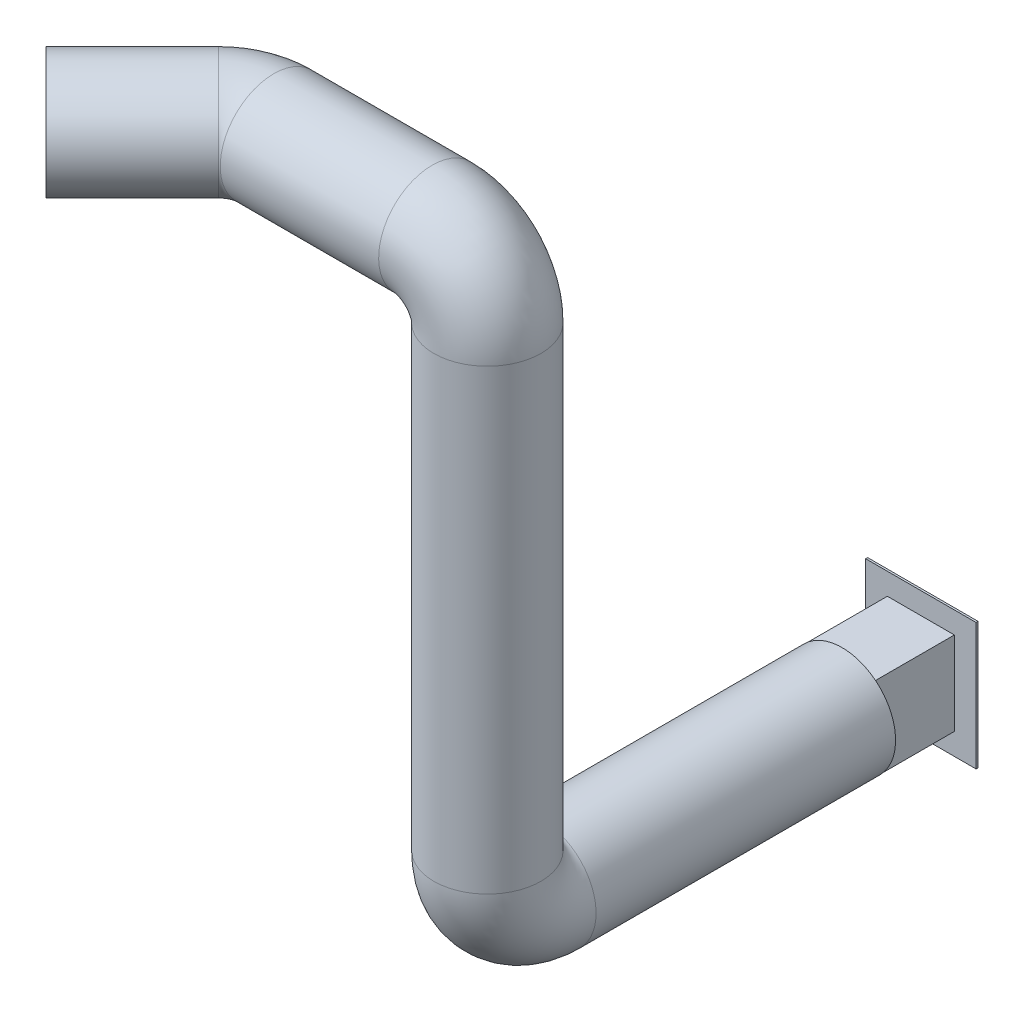
ISO-10303-21;
HEADER;
FILE_DESCRIPTION(('STEP AP214'),'2;1');
FILE_NAME('part.step','',(''),(''),'','','');
FILE_SCHEMA(('AUTOMOTIVE_DESIGN { 1 0 10303 214 1 1 1 1 }'));
ENDSEC;
DATA;
#1=APPLICATION_CONTEXT('core data for automotive mechanical design processes');
#2=APPLICATION_PROTOCOL_DEFINITION('international standard','automotive_design',2000,#1);
#3=PRODUCT_CONTEXT('',#1,'mechanical');
#4=PRODUCT('Part','Part','',(#3));
#5=PRODUCT_RELATED_PRODUCT_CATEGORY('part','',(#4));
#6=PRODUCT_DEFINITION_FORMATION('','',#4);
#7=PRODUCT_DEFINITION_CONTEXT('part definition',#1,'design');
#8=PRODUCT_DEFINITION('design','',#6,#7);
#9=PRODUCT_DEFINITION_SHAPE('','',#8);
#10=(LENGTH_UNIT() NAMED_UNIT(*) SI_UNIT(.MILLI.,.METRE.));
#11=(NAMED_UNIT(*) PLANE_ANGLE_UNIT() SI_UNIT($,.RADIAN.));
#12=(NAMED_UNIT(*) SI_UNIT($,.STERADIAN.) SOLID_ANGLE_UNIT());
#13=UNCERTAINTY_MEASURE_WITH_UNIT(LENGTH_MEASURE(1.E-05),#10,'distance_accuracy_value','');
#14=(GEOMETRIC_REPRESENTATION_CONTEXT(3) GLOBAL_UNCERTAINTY_ASSIGNED_CONTEXT((#13)) GLOBAL_UNIT_ASSIGNED_CONTEXT((#10,
#11,#12)) REPRESENTATION_CONTEXT('',''));
#15=CARTESIAN_POINT('',(0.,0.,0.));
#16=DIRECTION('',(0.,0.,1.));
#17=DIRECTION('',(1.,0.,0.));
#18=AXIS2_PLACEMENT_3D('',#15,#16,#17);
#19=CARTESIAN_POINT('',(0.,0.,2.5));
#20=DIRECTION('',(0.,0.,1.));
#21=DIRECTION('',(1.,0.,0.));
#22=AXIS2_PLACEMENT_3D('',#19,#20,#21);
#23=PLANE('',#22);
#24=DIRECTION('',(0.,-1.,0.));
#25=VECTOR('',#24,1.);
#26=CARTESIAN_POINT('',(0.,0.,2.5));
#27=LINE('',#26,#25);
#28=CARTESIAN_POINT('',(0.,0.,2.5));
#29=VERTEX_POINT('',#28);
#30=CARTESIAN_POINT('',(0.,-161.,2.5));
#31=VERTEX_POINT('',#30);
#32=EDGE_CURVE('E204',#29,#31,#27,.T.);
#33=ORIENTED_EDGE('',*,*,#32,.T.);
#34=DIRECTION('',(1.,0.,0.));
#35=VECTOR('',#34,1.);
#36=CARTESIAN_POINT('',(0.,-161.,2.5));
#37=LINE('',#36,#35);
#38=CARTESIAN_POINT('',(140.,-161.,2.5));
#39=VERTEX_POINT('',#38);
#40=EDGE_CURVE('E207',#31,#39,#37,.T.);
#41=ORIENTED_EDGE('',*,*,#40,.T.);
#42=DIRECTION('',(0.,1.,0.));
#43=VECTOR('',#42,1.);
#44=CARTESIAN_POINT('',(140.,0.,2.5));
#45=LINE('',#44,#43);
#46=CARTESIAN_POINT('',(140.,0.,2.5));
#47=VERTEX_POINT('',#46);
#48=EDGE_CURVE('E210',#39,#47,#45,.T.);
#49=ORIENTED_EDGE('',*,*,#48,.T.);
#50=DIRECTION('',(-1.,0.,0.));
#51=VECTOR('',#50,1.);
#52=CARTESIAN_POINT('',(0.,0.,2.5));
#53=LINE('',#52,#51);
#54=EDGE_CURVE('E212',#47,#29,#53,.T.);
#55=ORIENTED_EDGE('',*,*,#54,.T.);
#56=EDGE_LOOP('',(#33,#41,#49,#55));
#57=FACE_BOUND('',#56,.T.);
#58=DIRECTION('',(0.,-1.,0.));
#59=VECTOR('',#58,1.);
#60=CARTESIAN_POINT('',(27.5,-27.5,2.5));
#61=LINE('',#60,#59);
#62=CARTESIAN_POINT('',(27.5,-27.5,2.5));
#63=VERTEX_POINT('',#62);
#64=CARTESIAN_POINT('',(27.5,-133.5,2.5));
#65=VERTEX_POINT('',#64);
#66=EDGE_CURVE('E172',#63,#65,#61,.T.);
#67=ORIENTED_EDGE('',*,*,#66,.F.);
#68=DIRECTION('',(-1.,0.,0.));
#69=VECTOR('',#68,1.);
#70=CARTESIAN_POINT('',(27.5,-27.5,2.5));
#71=LINE('',#70,#69);
#72=CARTESIAN_POINT('',(112.5,-27.5,2.5));
#73=VERTEX_POINT('',#72);
#74=EDGE_CURVE('E155',#73,#63,#71,.T.);
#75=ORIENTED_EDGE('',*,*,#74,.F.);
#76=DIRECTION('',(0.,1.,0.));
#77=VECTOR('',#76,1.);
#78=CARTESIAN_POINT('',(112.5,-27.5,2.5));
#79=LINE('',#78,#77);
#80=CARTESIAN_POINT('',(112.5,-133.5,2.5));
#81=VERTEX_POINT('',#80);
#82=EDGE_CURVE('E160',#81,#73,#79,.T.);
#83=ORIENTED_EDGE('',*,*,#82,.F.);
#84=DIRECTION('',(1.,0.,0.));
#85=VECTOR('',#84,1.);
#86=CARTESIAN_POINT('',(27.5,-133.5,2.5));
#87=LINE('',#86,#85);
#88=EDGE_CURVE('E174',#65,#81,#87,.T.);
#89=ORIENTED_EDGE('',*,*,#88,.F.);
#90=EDGE_LOOP('',(#67,#75,#83,#89));
#91=FACE_BOUND('',#90,.T.);
#92=ADVANCED_FACE('F33',(#57,#91),#23,.T.);
#93=CARTESIAN_POINT('',(0.,0.,0.));
#94=DIRECTION('',(0.,0.,1.));
#95=DIRECTION('',(1.,0.,0.));
#96=AXIS2_PLACEMENT_3D('',#93,#94,#95);
#97=PLANE('',#96);
#98=DIRECTION('',(0.,-1.,0.));
#99=VECTOR('',#98,1.);
#100=CARTESIAN_POINT('',(0.,0.,0.));
#101=LINE('',#100,#99);
#102=CARTESIAN_POINT('',(0.,0.,0.));
#103=VERTEX_POINT('',#102);
#104=CARTESIAN_POINT('',(0.,-161.,0.));
#105=VERTEX_POINT('',#104);
#106=EDGE_CURVE('E203',#103,#105,#101,.T.);
#107=ORIENTED_EDGE('',*,*,#106,.F.);
#108=DIRECTION('',(-1.,0.,0.));
#109=VECTOR('',#108,1.);
#110=CARTESIAN_POINT('',(0.,0.,0.));
#111=LINE('',#110,#109);
#112=CARTESIAN_POINT('',(140.,0.,0.));
#113=VERTEX_POINT('',#112);
#114=EDGE_CURVE('E208',#113,#103,#111,.T.);
#115=ORIENTED_EDGE('',*,*,#114,.F.);
#116=DIRECTION('',(0.,1.,0.));
#117=VECTOR('',#116,1.);
#118=CARTESIAN_POINT('',(140.,0.,0.));
#119=LINE('',#118,#117);
#120=CARTESIAN_POINT('',(140.,-161.,0.));
#121=VERTEX_POINT('',#120);
#122=EDGE_CURVE('E219',#121,#113,#119,.T.);
#123=ORIENTED_EDGE('',*,*,#122,.F.);
#124=DIRECTION('',(1.,0.,0.));
#125=VECTOR('',#124,1.);
#126=CARTESIAN_POINT('',(0.,-161.,0.));
#127=LINE('',#126,#125);
#128=EDGE_CURVE('E217',#105,#121,#127,.T.);
#129=ORIENTED_EDGE('',*,*,#128,.F.);
#130=EDGE_LOOP('',(#107,#115,#123,#129));
#131=FACE_BOUND('',#130,.T.);
#132=DIRECTION('',(0.,1.,0.));
#133=VECTOR('',#132,1.);
#134=CARTESIAN_POINT('',(110.,-131.,0.));
#135=LINE('',#134,#133);
#136=CARTESIAN_POINT('',(110.,-131.,0.));
#137=VERTEX_POINT('',#136);
#138=CARTESIAN_POINT('',(110.,-30.,0.));
#139=VERTEX_POINT('',#138);
#140=EDGE_CURVE('E56',#137,#139,#135,.T.);
#141=ORIENTED_EDGE('',*,*,#140,.T.);
#142=DIRECTION('',(-1.,0.,0.));
#143=VECTOR('',#142,1.);
#144=CARTESIAN_POINT('',(30.,-30.,0.));
#145=LINE('',#144,#143);
#146=CARTESIAN_POINT('',(30.,-30.,0.));
#147=VERTEX_POINT('',#146);
#148=EDGE_CURVE('E186',#139,#147,#145,.T.);
#149=ORIENTED_EDGE('',*,*,#148,.T.);
#150=DIRECTION('',(0.,-1.,0.));
#151=VECTOR('',#150,1.);
#152=CARTESIAN_POINT('',(30.,-131.,0.));
#153=LINE('',#152,#151);
#154=CARTESIAN_POINT('',(30.,-131.,0.));
#155=VERTEX_POINT('',#154);
#156=EDGE_CURVE('E189',#147,#155,#153,.T.);
#157=ORIENTED_EDGE('',*,*,#156,.T.);
#158=DIRECTION('',(1.,0.,0.));
#159=VECTOR('',#158,1.);
#160=CARTESIAN_POINT('',(30.,-131.,0.));
#161=LINE('',#160,#159);
#162=EDGE_CURVE('E192',#155,#137,#161,.T.);
#163=ORIENTED_EDGE('',*,*,#162,.T.);
#164=EDGE_LOOP('',(#141,#149,#157,#163));
#165=FACE_BOUND('',#164,.T.);
#166=ADVANCED_FACE('F237',(#131,#165),#97,.F.);
#167=CARTESIAN_POINT('',(0.,0.,2.5));
#168=DIRECTION('',(1.,0.,0.));
#169=DIRECTION('',(0.,0.,-1.));
#170=AXIS2_PLACEMENT_3D('',#167,#168,#169);
#171=PLANE('',#170);
#172=ORIENTED_EDGE('',*,*,#106,.T.);
#173=DIRECTION('',(0.,0.,-1.));
#174=VECTOR('',#173,1.);
#175=CARTESIAN_POINT('',(0.,-161.,2.5));
#176=LINE('',#175,#174);
#177=EDGE_CURVE('E11',#31,#105,#176,.T.);
#178=ORIENTED_EDGE('',*,*,#177,.F.);
#179=ORIENTED_EDGE('',*,*,#32,.F.);
#180=DIRECTION('',(0.,0.,-1.));
#181=VECTOR('',#180,1.);
#182=CARTESIAN_POINT('',(0.,0.,2.5));
#183=LINE('',#182,#181);
#184=EDGE_CURVE('E214',#29,#103,#183,.T.);
#185=ORIENTED_EDGE('',*,*,#184,.T.);
#186=EDGE_LOOP('',(#172,#178,#179,#185));
#187=FACE_BOUND('',#186,.T.);
#188=ADVANCED_FACE('F35',(#187),#171,.F.);
#189=CARTESIAN_POINT('',(0.,-161.,2.5));
#190=DIRECTION('',(0.,1.,0.));
#191=DIRECTION('',(0.,0.,1.));
#192=AXIS2_PLACEMENT_3D('',#189,#190,#191);
#193=PLANE('',#192);
#194=ORIENTED_EDGE('',*,*,#128,.T.);
#195=DIRECTION('',(0.,0.,-1.));
#196=VECTOR('',#195,1.);
#197=CARTESIAN_POINT('',(140.,-161.,2.5));
#198=LINE('',#197,#196);
#199=EDGE_CURVE('E41',#39,#121,#198,.T.);
#200=ORIENTED_EDGE('',*,*,#199,.F.);
#201=ORIENTED_EDGE('',*,*,#40,.F.);
#202=ORIENTED_EDGE('',*,*,#177,.T.);
#203=EDGE_LOOP('',(#194,#200,#201,#202));
#204=FACE_BOUND('',#203,.T.);
#205=ADVANCED_FACE('F248',(#204),#193,.F.);
#206=CARTESIAN_POINT('',(140.,0.,2.5));
#207=DIRECTION('',(-1.,0.,0.));
#208=DIRECTION('',(0.,0.,1.));
#209=AXIS2_PLACEMENT_3D('',#206,#207,#208);
#210=PLANE('',#209);
#211=ORIENTED_EDGE('',*,*,#122,.T.);
#212=DIRECTION('',(0.,0.,-1.));
#213=VECTOR('',#212,1.);
#214=CARTESIAN_POINT('',(140.,0.,2.5));
#215=LINE('',#214,#213);
#216=EDGE_CURVE('E224',#47,#113,#215,.T.);
#217=ORIENTED_EDGE('',*,*,#216,.F.);
#218=ORIENTED_EDGE('',*,*,#48,.F.);
#219=ORIENTED_EDGE('',*,*,#199,.T.);
#220=EDGE_LOOP('',(#211,#217,#218,#219));
#221=FACE_BOUND('',#220,.T.);
#222=ADVANCED_FACE('F231',(#221),#210,.F.);
#223=CARTESIAN_POINT('',(0.,0.,2.5));
#224=DIRECTION('',(0.,-1.,0.));
#225=DIRECTION('',(1.,0.,0.));
#226=AXIS2_PLACEMENT_3D('',#223,#224,#225);
#227=PLANE('',#226);
#228=ORIENTED_EDGE('',*,*,#114,.T.);
#229=ORIENTED_EDGE('',*,*,#184,.F.);
#230=ORIENTED_EDGE('',*,*,#54,.F.);
#231=ORIENTED_EDGE('',*,*,#216,.T.);
#232=EDGE_LOOP('',(#228,#229,#230,#231));
#233=FACE_BOUND('',#232,.T.);
#234=ADVANCED_FACE('F241',(#233),#227,.F.);
#235=CARTESIAN_POINT('',(110.,-131.,2.5));
#236=DIRECTION('',(-1.,0.,0.));
#237=DIRECTION('',(0.,0.,1.));
#238=AXIS2_PLACEMENT_3D('',#235,#236,#237);
#239=PLANE('',#238);
#240=ORIENTED_EDGE('',*,*,#140,.F.);
#241=DIRECTION('',(0.,0.,-1.));
#242=VECTOR('',#241,1.);
#243=CARTESIAN_POINT('',(110.,-131.,2.5));
#244=LINE('',#243,#242);
#245=CARTESIAN_POINT('',(110.,-131.,102.5));
#246=VERTEX_POINT('',#245);
#247=EDGE_CURVE('E195',#246,#137,#244,.T.);
#248=ORIENTED_EDGE('',*,*,#247,.F.);
#249=DIRECTION('',(0.,1.,0.));
#250=VECTOR('',#249,1.);
#251=CARTESIAN_POINT('',(110.,-30.,102.5));
#252=LINE('',#251,#250);
#253=CARTESIAN_POINT('',(110.,-30.,102.5));
#254=VERTEX_POINT('',#253);
#255=EDGE_CURVE('E149',#246,#254,#252,.T.);
#256=ORIENTED_EDGE('',*,*,#255,.T.);
#257=DIRECTION('',(0.,0.,-1.));
#258=VECTOR('',#257,1.);
#259=CARTESIAN_POINT('',(110.,-30.,2.5));
#260=LINE('',#259,#258);
#261=EDGE_CURVE('E201',#254,#139,#260,.T.);
#262=ORIENTED_EDGE('',*,*,#261,.T.);
#263=EDGE_LOOP('',(#240,#248,#256,#262));
#264=FACE_BOUND('',#263,.T.);
#265=ADVANCED_FACE('F262',(#264),#239,.T.);
#266=CARTESIAN_POINT('',(30.,-30.,2.5));
#267=DIRECTION('',(0.,-1.,0.));
#268=DIRECTION('',(0.,0.,-1.));
#269=AXIS2_PLACEMENT_3D('',#266,#267,#268);
#270=PLANE('',#269);
#271=ORIENTED_EDGE('',*,*,#148,.F.);
#272=ORIENTED_EDGE('',*,*,#261,.F.);
#273=DIRECTION('',(-1.,0.,0.));
#274=VECTOR('',#273,1.);
#275=CARTESIAN_POINT('',(30.,-30.,102.5));
#276=LINE('',#275,#274);
#277=CARTESIAN_POINT('',(30.,-30.,102.5));
#278=VERTEX_POINT('',#277);
#279=EDGE_CURVE('E152',#254,#278,#276,.T.);
#280=ORIENTED_EDGE('',*,*,#279,.T.);
#281=DIRECTION('',(0.,0.,-1.));
#282=VECTOR('',#281,1.);
#283=CARTESIAN_POINT('',(30.,-30.,2.5));
#284=LINE('',#283,#282);
#285=EDGE_CURVE('E199',#278,#147,#284,.T.);
#286=ORIENTED_EDGE('',*,*,#285,.T.);
#287=EDGE_LOOP('',(#271,#272,#280,#286));
#288=FACE_BOUND('',#287,.T.);
#289=ADVANCED_FACE('F269',(#288),#270,.T.);
#290=CARTESIAN_POINT('',(30.,-131.,2.5));
#291=DIRECTION('',(1.,0.,0.));
#292=DIRECTION('',(0.,0.,-1.));
#293=AXIS2_PLACEMENT_3D('',#290,#291,#292);
#294=PLANE('',#293);
#295=ORIENTED_EDGE('',*,*,#156,.F.);
#296=ORIENTED_EDGE('',*,*,#285,.F.);
#297=DIRECTION('',(0.,-1.,0.));
#298=VECTOR('',#297,1.);
#299=CARTESIAN_POINT('',(30.,-30.,102.5));
#300=LINE('',#299,#298);
#301=CARTESIAN_POINT('',(30.,-131.,102.5));
#302=VERTEX_POINT('',#301);
#303=EDGE_CURVE('E142',#278,#302,#300,.T.);
#304=ORIENTED_EDGE('',*,*,#303,.T.);
#305=DIRECTION('',(0.,0.,-1.));
#306=VECTOR('',#305,1.);
#307=CARTESIAN_POINT('',(30.,-131.,2.5));
#308=LINE('',#307,#306);
#309=EDGE_CURVE('E197',#302,#155,#308,.T.);
#310=ORIENTED_EDGE('',*,*,#309,.T.);
#311=EDGE_LOOP('',(#295,#296,#304,#310));
#312=FACE_BOUND('',#311,.T.);
#313=ADVANCED_FACE('F273',(#312),#294,.T.);
#314=CARTESIAN_POINT('',(30.,-131.,2.5));
#315=DIRECTION('',(0.,1.,0.));
#316=DIRECTION('',(0.,0.,1.));
#317=AXIS2_PLACEMENT_3D('',#314,#315,#316);
#318=PLANE('',#317);
#319=ORIENTED_EDGE('',*,*,#162,.F.);
#320=ORIENTED_EDGE('',*,*,#309,.F.);
#321=DIRECTION('',(1.,0.,0.));
#322=VECTOR('',#321,1.);
#323=CARTESIAN_POINT('',(30.,-131.,102.5));
#324=LINE('',#323,#322);
#325=EDGE_CURVE('E146',#302,#246,#324,.T.);
#326=ORIENTED_EDGE('',*,*,#325,.T.);
#327=ORIENTED_EDGE('',*,*,#247,.T.);
#328=EDGE_LOOP('',(#319,#320,#326,#327));
#329=FACE_BOUND('',#328,.T.);
#330=ADVANCED_FACE('F278',(#329),#318,.T.);
#331=CARTESIAN_POINT('',(27.5,-27.5,102.5));
#332=DIRECTION('',(0.,-1.,0.));
#333=DIRECTION('',(0.,0.,-1.));
#334=AXIS2_PLACEMENT_3D('',#331,#332,#333);
#335=PLANE('',#334);
#336=ORIENTED_EDGE('',*,*,#74,.T.);
#337=DIRECTION('',(0.,0.,-1.));
#338=VECTOR('',#337,1.);
#339=CARTESIAN_POINT('',(27.5,-27.5,102.5));
#340=LINE('',#339,#338);
#341=CARTESIAN_POINT('',(27.5,-27.5,102.5));
#342=VERTEX_POINT('',#341);
#343=EDGE_CURVE('E183',#342,#63,#340,.T.);
#344=ORIENTED_EDGE('',*,*,#343,.F.);
#345=DIRECTION('',(-1.,0.,0.));
#346=VECTOR('',#345,1.);
#347=CARTESIAN_POINT('',(27.5,-27.5,102.5));
#348=LINE('',#347,#346);
#349=CARTESIAN_POINT('',(112.5,-27.5,102.5));
#350=VERTEX_POINT('',#349);
#351=EDGE_CURVE('E156',#350,#342,#348,.T.);
#352=ORIENTED_EDGE('',*,*,#351,.F.);
#353=DIRECTION('',(0.,0.,-1.));
#354=VECTOR('',#353,1.);
#355=CARTESIAN_POINT('',(112.5,-27.5,102.5));
#356=LINE('',#355,#354);
#357=EDGE_CURVE('E169',#350,#73,#356,.T.);
#358=ORIENTED_EDGE('',*,*,#357,.T.);
#359=EDGE_LOOP('',(#336,#344,#352,#358));
#360=FACE_BOUND('',#359,.T.);
#361=ADVANCED_FACE('F284',(#360),#335,.F.);
#362=CARTESIAN_POINT('',(27.5,-27.5,102.5));
#363=DIRECTION('',(1.,0.,0.));
#364=DIRECTION('',(0.,0.,-1.));
#365=AXIS2_PLACEMENT_3D('',#362,#363,#364);
#366=PLANE('',#365);
#367=ORIENTED_EDGE('',*,*,#66,.T.);
#368=DIRECTION('',(0.,0.,-1.));
#369=VECTOR('',#368,1.);
#370=CARTESIAN_POINT('',(27.5,-133.5,102.5));
#371=LINE('',#370,#369);
#372=CARTESIAN_POINT('',(27.5,-133.5,102.5));
#373=VERTEX_POINT('',#372);
#374=EDGE_CURVE('E180',#373,#65,#371,.T.);
#375=ORIENTED_EDGE('',*,*,#374,.F.);
#376=DIRECTION('',(0.,-1.,0.));
#377=VECTOR('',#376,1.);
#378=CARTESIAN_POINT('',(27.5,-27.5,102.5));
#379=LINE('',#378,#377);
#380=EDGE_CURVE('E159',#342,#373,#379,.T.);
#381=ORIENTED_EDGE('',*,*,#380,.F.);
#382=ORIENTED_EDGE('',*,*,#343,.T.);
#383=EDGE_LOOP('',(#367,#375,#381,#382));
#384=FACE_BOUND('',#383,.T.);
#385=ADVANCED_FACE('F288',(#384),#366,.F.);
#386=CARTESIAN_POINT('',(27.5,-133.5,102.5));
#387=DIRECTION('',(0.,1.,0.));
#388=DIRECTION('',(0.,0.,1.));
#389=AXIS2_PLACEMENT_3D('',#386,#387,#388);
#390=PLANE('',#389);
#391=ORIENTED_EDGE('',*,*,#88,.T.);
#392=DIRECTION('',(0.,0.,-1.));
#393=VECTOR('',#392,1.);
#394=CARTESIAN_POINT('',(112.5,-133.5,102.5));
#395=LINE('',#394,#393);
#396=CARTESIAN_POINT('',(112.5,-133.5,102.5));
#397=VERTEX_POINT('',#396);
#398=EDGE_CURVE('E48',#397,#81,#395,.T.);
#399=ORIENTED_EDGE('',*,*,#398,.F.);
#400=DIRECTION('',(1.,0.,0.));
#401=VECTOR('',#400,1.);
#402=CARTESIAN_POINT('',(27.5,-133.5,102.5));
#403=LINE('',#402,#401);
#404=EDGE_CURVE('E163',#373,#397,#403,.T.);
#405=ORIENTED_EDGE('',*,*,#404,.F.);
#406=ORIENTED_EDGE('',*,*,#374,.T.);
#407=EDGE_LOOP('',(#391,#399,#405,#406));
#408=FACE_BOUND('',#407,.T.);
#409=ADVANCED_FACE('F292',(#408),#390,.F.);
#410=CARTESIAN_POINT('',(112.5,-27.5,102.5));
#411=DIRECTION('',(-1.,0.,0.));
#412=DIRECTION('',(0.,0.,1.));
#413=AXIS2_PLACEMENT_3D('',#410,#411,#412);
#414=PLANE('',#413);
#415=ORIENTED_EDGE('',*,*,#82,.T.);
#416=ORIENTED_EDGE('',*,*,#357,.F.);
#417=DIRECTION('',(0.,1.,0.));
#418=VECTOR('',#417,1.);
#419=CARTESIAN_POINT('',(112.5,-27.5,102.5));
#420=LINE('',#419,#418);
#421=EDGE_CURVE('E166',#397,#350,#420,.T.);
#422=ORIENTED_EDGE('',*,*,#421,.F.);
#423=ORIENTED_EDGE('',*,*,#398,.T.);
#424=EDGE_LOOP('',(#415,#416,#422,#423));
#425=FACE_BOUND('',#424,.T.);
#426=ADVANCED_FACE('F296',(#425),#414,.F.);
#427=CARTESIAN_POINT('',(70.,-80.5,102.5));
#428=DIRECTION('',(0.,0.,1.));
#429=DIRECTION('',(1.,0.,0.));
#430=AXIS2_PLACEMENT_3D('',#427,#428,#429);
#431=PLANE('',#430);
#432=ORIENTED_EDGE('',*,*,#303,.F.);
#433=ORIENTED_EDGE('',*,*,#279,.F.);
#434=ORIENTED_EDGE('',*,*,#255,.F.);
#435=ORIENTED_EDGE('',*,*,#325,.F.);
#436=EDGE_LOOP('',(#432,#433,#434,#435));
#437=FACE_BOUND('',#436,.T.);
#438=ADVANCED_FACE('F300',(#437),#431,.F.);
#439=CARTESIAN_POINT('',(70.,-80.5,102.5));
#440=DIRECTION('',(0.,0.,1.));
#441=DIRECTION('',(1.,0.,0.));
#442=AXIS2_PLACEMENT_3D('',#439,#440,#441);
#443=CIRCLE('',#442,67.9356312990466);
#444=EDGE_CURVE('E135',#350,#342,#443,.T.);
#445=ORIENTED_EDGE('',*,*,#444,.F.);
#446=ORIENTED_EDGE('',*,*,#351,.T.);
#447=EDGE_LOOP('',(#445,#446));
#448=FACE_BOUND('',#447,.T.);
#449=ADVANCED_FACE('F310',(#448),#431,.F.);
#450=EDGE_CURVE('E143',#342,#373,#443,.T.);
#451=ORIENTED_EDGE('',*,*,#450,.F.);
#452=ORIENTED_EDGE('',*,*,#380,.T.);
#453=EDGE_LOOP('',(#451,#452));
#454=FACE_BOUND('',#453,.T.);
#455=ADVANCED_FACE('F420',(#454),#431,.F.);
#456=EDGE_CURVE('E133',#373,#397,#443,.T.);
#457=ORIENTED_EDGE('',*,*,#456,.F.);
#458=ORIENTED_EDGE('',*,*,#404,.T.);
#459=EDGE_LOOP('',(#457,#458));
#460=FACE_BOUND('',#459,.T.);
#461=ADVANCED_FACE('F305',(#460),#431,.F.);
#462=CARTESIAN_POINT('',(70.,-80.5,202.5));
#463=DIRECTION('',(0.,0.,-1.));
#464=DIRECTION('',(-1.,0.,0.));
#465=AXIS2_PLACEMENT_3D('',#462,#463,#464);
#466=CYLINDRICAL_SURFACE('',#465,67.9356312990466);
#467=ORIENTED_EDGE('',*,*,#444,.T.);
#468=ORIENTED_EDGE('',*,*,#450,.T.);
#469=ORIENTED_EDGE('',*,*,#456,.T.);
#470=EDGE_CURVE('E129',#397,#350,#443,.T.);
#471=ORIENTED_EDGE('',*,*,#470,.T.);
#472=EDGE_LOOP('',(#467,#468,#469,#471));
#473=FACE_BOUND('',#472,.T.);
#474=CARTESIAN_POINT('',(70.,-80.5,482.5));
#475=DIRECTION('',(0.,0.,1.));
#476=DIRECTION('',(1.,0.,0.));
#477=AXIS2_PLACEMENT_3D('',#474,#475,#476);
#478=CIRCLE('',#477,67.9356312990466);
#479=CARTESIAN_POINT('',(70.,-148.435631299047,482.5));
#480=VERTEX_POINT('',#479);
#481=EDGE_CURVE('E343',#480,#480,#478,.T.);
#482=ORIENTED_EDGE('',*,*,#481,.F.);
#483=EDGE_LOOP('',(#482));
#484=FACE_BOUND('',#483,.T.);
#485=ADVANCED_FACE('F301',(#473,#484),#466,.T.);
#486=ORIENTED_EDGE('',*,*,#470,.F.);
#487=ORIENTED_EDGE('',*,*,#421,.T.);
#488=EDGE_LOOP('',(#486,#487));
#489=FACE_BOUND('',#488,.T.);
#490=ADVANCED_FACE('F304',(#489),#431,.F.);
#491=CARTESIAN_POINT('',(-360.,639.5,682.5));
#492=DIRECTION('',(-0.707106781186547,0.,0.707106781186547));
#493=DIRECTION('',(0.,1.,0.));
#494=AXIS2_PLACEMENT_3D('',#491,#492,#493);
#495=PLANE('',#494);
#496=CARTESIAN_POINT('',(-360.,639.5,682.5));
#497=DIRECTION('',(-0.707106781186547,0.,0.707106781186547));
#498=DIRECTION('',(0.,1.,0.));
#499=AXIS2_PLACEMENT_3D('',#496,#497,#498);
#500=CIRCLE('',#499,67.9356312990466);
#501=CARTESIAN_POINT('',(-360.,707.435631299047,682.5));
#502=VERTEX_POINT('',#501);
#503=EDGE_CURVE('E126',#502,#502,#500,.T.);
#504=ORIENTED_EDGE('',*,*,#503,.T.);
#505=EDGE_LOOP('',(#504));
#506=FACE_BOUND('',#505,.T.);
#507=ADVANCED_FACE('F127',(#506),#495,.T.);
#508=CARTESIAN_POINT('',(70.,-10.5,482.5));
#509=DIRECTION('',(-1.,0.,0.));
#510=DIRECTION('',(0.,0.,1.));
#511=AXIS2_PLACEMENT_3D('',#508,#509,#510);
#512=TOROIDAL_SURFACE('',#511,70.,67.9356312990466);
#513=CARTESIAN_POINT('',(70.,-10.5,552.5));
#514=DIRECTION('',(0.,1.,0.));
#515=DIRECTION('',(1.,0.,0.));
#516=AXIS2_PLACEMENT_3D('',#513,#514,#515);
#517=CIRCLE('',#516,67.9356312990466);
#518=CARTESIAN_POINT('',(70.,-10.5,620.435631299047));
#519=VERTEX_POINT('',#518);
#520=EDGE_CURVE('E340',#519,#519,#517,.T.);
#521=CARTESIAN_POINT('',(70.,-10.5,482.5));
#522=DIRECTION('',(-1.,0.,0.));
#523=DIRECTION('',(0.,0.,1.));
#524=AXIS2_PLACEMENT_3D('',#521,#522,#523);
#525=CIRCLE('',#524,137.935631299047);
#526=EDGE_CURVE('',#480,#519,#525,.T.);
#527=ORIENTED_EDGE('',*,*,#481,.T.);
#528=ORIENTED_EDGE('',*,*,#520,.F.);
#529=ORIENTED_EDGE('',*,*,#526,.T.);
#530=ORIENTED_EDGE('',*,*,#526,.F.);
#531=EDGE_LOOP('',(#527,#529,#528,#530));
#532=FACE_BOUND('',#531,.T.);
#533=ADVANCED_FACE('F314',(#532),#512,.T.);
#534=CARTESIAN_POINT('',(70.,-10.5,552.5));
#535=DIRECTION('',(0.,1.,0.));
#536=DIRECTION('',(0.,0.,1.));
#537=AXIS2_PLACEMENT_3D('',#534,#535,#536);
#538=CYLINDRICAL_SURFACE('',#537,67.9356312990466);
#539=CARTESIAN_POINT('',(70.,569.5,552.5));
#540=DIRECTION('',(0.,1.,0.));
#541=DIRECTION('',(1.,0.,0.));
#542=AXIS2_PLACEMENT_3D('',#539,#540,#541);
#543=CIRCLE('',#542,67.9356312990466);
#544=CARTESIAN_POINT('',(137.935631299047,569.5,552.5));
#545=VERTEX_POINT('',#544);
#546=EDGE_CURVE('E346',#545,#545,#543,.T.);
#547=ORIENTED_EDGE('',*,*,#546,.F.);
#548=EDGE_LOOP('',(#547));
#549=FACE_BOUND('',#548,.T.);
#550=ORIENTED_EDGE('',*,*,#520,.T.);
#551=EDGE_LOOP('',(#550));
#552=FACE_BOUND('',#551,.T.);
#553=ADVANCED_FACE('F328',(#549,#552),#538,.T.);
#554=CARTESIAN_POINT('',(0.,569.5,552.5));
#555=DIRECTION('',(0.,0.,1.));
#556=DIRECTION('',(1.,0.,0.));
#557=AXIS2_PLACEMENT_3D('',#554,#555,#556);
#558=TOROIDAL_SURFACE('',#557,70.,67.9356312990466);
#559=CARTESIAN_POINT('',(0.,639.5,552.5));
#560=DIRECTION('',(-1.,0.,0.));
#561=DIRECTION('',(0.,1.,0.));
#562=AXIS2_PLACEMENT_3D('',#559,#560,#561);
#563=CIRCLE('',#562,67.9356312990466);
#564=CARTESIAN_POINT('',(0.,707.435631299046,552.5));
#565=VERTEX_POINT('',#564);
#566=EDGE_CURVE('E351',#565,#565,#563,.T.);
#567=CARTESIAN_POINT('',(0.,569.5,552.5));
#568=DIRECTION('',(0.,0.,1.));
#569=DIRECTION('',(1.,0.,0.));
#570=AXIS2_PLACEMENT_3D('',#567,#568,#569);
#571=CIRCLE('',#570,137.935631299047);
#572=EDGE_CURVE('',#545,#565,#571,.T.);
#573=ORIENTED_EDGE('',*,*,#546,.T.);
#574=ORIENTED_EDGE('',*,*,#566,.F.);
#575=ORIENTED_EDGE('',*,*,#572,.T.);
#576=ORIENTED_EDGE('',*,*,#572,.F.);
#577=EDGE_LOOP('',(#573,#575,#574,#576));
#578=FACE_BOUND('',#577,.T.);
#579=ADVANCED_FACE('F324',(#578),#558,.T.);
#580=CARTESIAN_POINT('',(0.,639.5,552.5));
#581=DIRECTION('',(-1.,0.,0.));
#582=DIRECTION('',(0.,0.,1.));
#583=AXIS2_PLACEMENT_3D('',#580,#581,#582);
#584=CYLINDRICAL_SURFACE('',#583,67.9356312990466);
#585=CARTESIAN_POINT('',(-201.005050633883,639.5,552.5));
#586=DIRECTION('',(-1.,0.,0.));
#587=DIRECTION('',(0.,1.,0.));
#588=AXIS2_PLACEMENT_3D('',#585,#586,#587);
#589=CIRCLE('',#588,67.9356312990466);
#590=CARTESIAN_POINT('',(-201.005050633883,639.5,484.564368700953));
#591=VERTEX_POINT('',#590);
#592=EDGE_CURVE('E137',#591,#591,#589,.T.);
#593=ORIENTED_EDGE('',*,*,#592,.F.);
#594=EDGE_LOOP('',(#593));
#595=FACE_BOUND('',#594,.T.);
#596=ORIENTED_EDGE('',*,*,#566,.T.);
#597=EDGE_LOOP('',(#596));
#598=FACE_BOUND('',#597,.T.);
#599=ADVANCED_FACE('F320',(#595,#598),#584,.T.);
#600=CARTESIAN_POINT('',(-201.005050633883,639.5,622.5));
#601=DIRECTION('',(0.,1.,0.));
#602=DIRECTION('',(0.,0.,1.));
#603=AXIS2_PLACEMENT_3D('',#600,#601,#602);
#604=TOROIDAL_SURFACE('',#603,70.,67.9356312990466);
#605=CARTESIAN_POINT('',(-250.502525316942,639.5,573.002525316942));
#606=DIRECTION('',(-0.707106781186548,0.,0.707106781186547));
#607=DIRECTION('',(0.,1.,0.));
#608=AXIS2_PLACEMENT_3D('',#605,#606,#607);
#609=CIRCLE('',#608,67.9356312990466);
#610=CARTESIAN_POINT('',(-298.540270892687,639.5,524.964779741197));
#611=VERTEX_POINT('',#610);
#612=EDGE_CURVE('E130',#611,#611,#609,.T.);
#613=CARTESIAN_POINT('',(-201.005050633883,639.5,622.5));
#614=DIRECTION('',(0.,1.,0.));
#615=DIRECTION('',(0.,0.,1.));
#616=AXIS2_PLACEMENT_3D('',#613,#614,#615);
#617=CIRCLE('',#616,137.935631299047);
#618=EDGE_CURVE('',#591,#611,#617,.T.);
#619=ORIENTED_EDGE('',*,*,#592,.T.);
#620=ORIENTED_EDGE('',*,*,#612,.F.);
#621=ORIENTED_EDGE('',*,*,#618,.T.);
#622=ORIENTED_EDGE('',*,*,#618,.F.);
#623=EDGE_LOOP('',(#619,#621,#620,#622));
#624=FACE_BOUND('',#623,.T.);
#625=ADVANCED_FACE('F317',(#624),#604,.T.);
#626=CARTESIAN_POINT('',(-250.502525316942,639.5,573.002525316942));
#627=DIRECTION('',(-0.707106781186548,0.,0.707106781186548));
#628=DIRECTION('',(0.707106781186548,0.,0.707106781186548));
#629=AXIS2_PLACEMENT_3D('',#626,#627,#628);
#630=CYLINDRICAL_SURFACE('',#629,67.9356312990466);
#631=ORIENTED_EDGE('',*,*,#503,.F.);
#632=EDGE_LOOP('',(#631));
#633=FACE_BOUND('',#632,.T.);
#634=ORIENTED_EDGE('',*,*,#612,.T.);
#635=EDGE_LOOP('',(#634));
#636=FACE_BOUND('',#635,.T.);
#637=ADVANCED_FACE('F311',(#633,#636),#630,.T.);
#638=CLOSED_SHELL('',(#92,#166,#188,#205,#222,#234,#265,#289,#313,#330,#361,#385,#409,#426,#438,
#449,#455,#461,#485,#490,#507,#533,#553,#579,#599,#625,#637));
#639=MANIFOLD_SOLID_BREP('B2',#638);
#640=ADVANCED_BREP_SHAPE_REPRESENTATION('',(#18,#639),#14);
#641=SHAPE_DEFINITION_REPRESENTATION(#9,#640);
ENDSEC;
END-ISO-10303-21;
